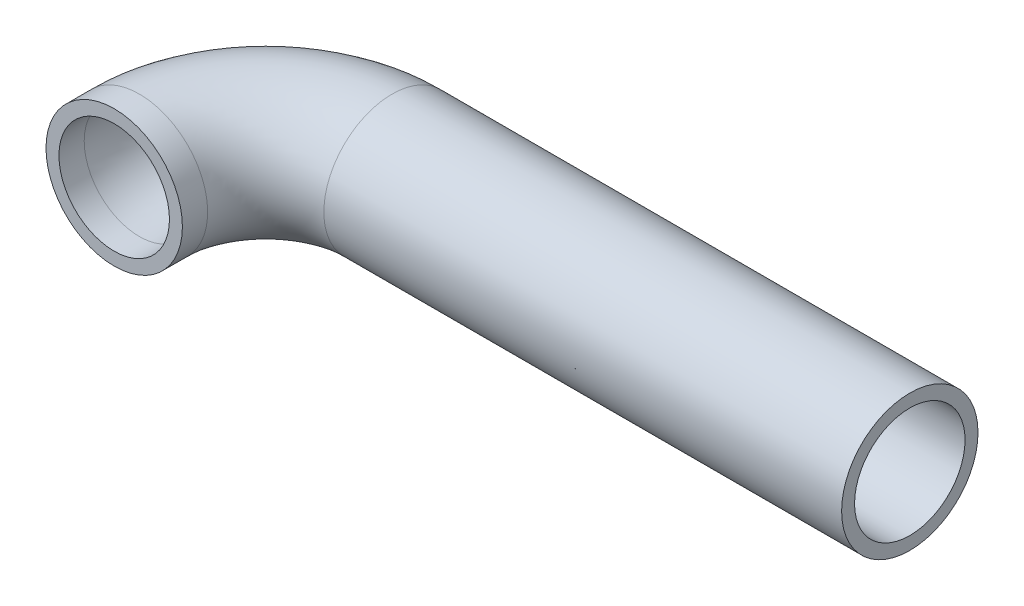
ISO-10303-21;
HEADER;
FILE_DESCRIPTION(('STEP AP214'),'2;1');
FILE_NAME('part.step','',(''),(''),'','','');
FILE_SCHEMA(('AUTOMOTIVE_DESIGN { 1 0 10303 214 1 1 1 1 }'));
ENDSEC;
DATA;
#1=APPLICATION_CONTEXT('core data for automotive mechanical design processes');
#2=APPLICATION_PROTOCOL_DEFINITION('international standard','automotive_design',2000,#1);
#3=PRODUCT_CONTEXT('',#1,'mechanical');
#4=PRODUCT('Part','Part','',(#3));
#5=PRODUCT_RELATED_PRODUCT_CATEGORY('part','',(#4));
#6=PRODUCT_DEFINITION_FORMATION('','',#4);
#7=PRODUCT_DEFINITION_CONTEXT('part definition',#1,'design');
#8=PRODUCT_DEFINITION('design','',#6,#7);
#9=PRODUCT_DEFINITION_SHAPE('','',#8);
#10=(LENGTH_UNIT() NAMED_UNIT(*) SI_UNIT(.MILLI.,.METRE.));
#11=(NAMED_UNIT(*) PLANE_ANGLE_UNIT() SI_UNIT($,.RADIAN.));
#12=(NAMED_UNIT(*) SI_UNIT($,.STERADIAN.) SOLID_ANGLE_UNIT());
#13=UNCERTAINTY_MEASURE_WITH_UNIT(LENGTH_MEASURE(1.E-05),#10,'distance_accuracy_value','');
#14=(GEOMETRIC_REPRESENTATION_CONTEXT(3) GLOBAL_UNCERTAINTY_ASSIGNED_CONTEXT((#13)) GLOBAL_UNIT_ASSIGNED_CONTEXT((#10,
#11,#12)) REPRESENTATION_CONTEXT('',''));
#15=CARTESIAN_POINT('',(0.,0.,0.));
#16=DIRECTION('',(0.,0.,1.));
#17=DIRECTION('',(1.,0.,0.));
#18=AXIS2_PLACEMENT_3D('',#15,#16,#17);
#19=CARTESIAN_POINT('',(0.,0.,0.));
#20=DIRECTION('',(0.,0.,-1.));
#21=DIRECTION('',(-1.,0.,0.));
#22=AXIS2_PLACEMENT_3D('',#19,#20,#21);
#23=CYLINDRICAL_SURFACE('',#22,6.858);
#24=CARTESIAN_POINT('',(0.,0.,-2.54));
#25=DIRECTION('',(0.,0.,1.));
#26=DIRECTION('',(1.,0.,0.));
#27=AXIS2_PLACEMENT_3D('',#24,#25,#26);
#28=CIRCLE('',#27,6.858);
#29=CARTESIAN_POINT('',(-6.858,0.,-2.54));
#30=VERTEX_POINT('',#29);
#31=EDGE_CURVE('E64',#30,#30,#28,.T.);
#32=ORIENTED_EDGE('',*,*,#31,.T.);
#33=EDGE_LOOP('',(#32));
#34=FACE_BOUND('',#33,.T.);
#35=CARTESIAN_POINT('',(0.,0.,0.));
#36=DIRECTION('',(0.,0.,1.));
#37=DIRECTION('',(1.,0.,0.));
#38=AXIS2_PLACEMENT_3D('',#35,#36,#37);
#39=CIRCLE('',#38,6.858);
#40=CARTESIAN_POINT('',(6.858,0.,0.));
#41=VERTEX_POINT('',#40);
#42=EDGE_CURVE('E61',#41,#41,#39,.T.);
#43=ORIENTED_EDGE('',*,*,#42,.F.);
#44=EDGE_LOOP('',(#43));
#45=FACE_BOUND('',#44,.T.);
#46=ADVANCED_FACE('F37',(#34,#45),#23,.T.);
#47=CARTESIAN_POINT('',(12.7,0.,-2.54));
#48=DIRECTION('',(0.,-1.,0.));
#49=DIRECTION('',(0.,0.,-1.));
#50=AXIS2_PLACEMENT_3D('',#47,#48,#49);
#51=TOROIDAL_SURFACE('',#50,12.7,6.858);
#52=CARTESIAN_POINT('',(12.7,0.,-15.24));
#53=DIRECTION('',(-1.,0.,0.));
#54=DIRECTION('',(0.,0.,1.));
#55=AXIS2_PLACEMENT_3D('',#52,#53,#54);
#56=CIRCLE('',#55,6.858);
#57=CARTESIAN_POINT('',(12.7,0.,-22.098));
#58=VERTEX_POINT('',#57);
#59=EDGE_CURVE('E41',#58,#58,#56,.T.);
#60=CARTESIAN_POINT('',(12.7,0.,-2.54));
#61=DIRECTION('',(0.,-1.,0.));
#62=DIRECTION('',(0.,0.,-1.));
#63=AXIS2_PLACEMENT_3D('',#60,#61,#62);
#64=CIRCLE('',#63,19.558);
#65=EDGE_CURVE('',#30,#58,#64,.T.);
#66=ORIENTED_EDGE('',*,*,#31,.F.);
#67=ORIENTED_EDGE('',*,*,#59,.T.);
#68=ORIENTED_EDGE('',*,*,#65,.T.);
#69=ORIENTED_EDGE('',*,*,#65,.F.);
#70=EDGE_LOOP('',(#66,#68,#67,#69));
#71=FACE_BOUND('',#70,.T.);
#72=ADVANCED_FACE('F73',(#71),#51,.T.);
#73=CARTESIAN_POINT('',(12.7,0.,-15.24));
#74=DIRECTION('',(1.,0.,0.));
#75=DIRECTION('',(0.,0.,-1.));
#76=AXIS2_PLACEMENT_3D('',#73,#74,#75);
#77=CYLINDRICAL_SURFACE('',#76,6.858);
#78=CARTESIAN_POINT('',(64.7699999999999,0.,-15.24));
#79=DIRECTION('',(-1.,0.,0.));
#80=DIRECTION('',(0.,0.,1.));
#81=AXIS2_PLACEMENT_3D('',#78,#79,#80);
#82=CIRCLE('',#81,6.858);
#83=CARTESIAN_POINT('',(64.7699999999999,0.,-8.382));
#84=VERTEX_POINT('',#83);
#85=EDGE_CURVE('E56',#84,#84,#82,.T.);
#86=ORIENTED_EDGE('',*,*,#85,.T.);
#87=EDGE_LOOP('',(#86));
#88=FACE_BOUND('',#87,.T.);
#89=ORIENTED_EDGE('',*,*,#59,.F.);
#90=EDGE_LOOP('',(#89));
#91=FACE_BOUND('',#90,.T.);
#92=ADVANCED_FACE('F39',(#88,#91),#77,.T.);
#93=CARTESIAN_POINT('',(0.,0.,0.));
#94=DIRECTION('',(0.,0.,1.));
#95=DIRECTION('',(1.,0.,0.));
#96=AXIS2_PLACEMENT_3D('',#93,#94,#95);
#97=PLANE('',#96);
#98=CARTESIAN_POINT('',(0.,0.,0.));
#99=DIRECTION('',(0.,0.,1.));
#100=DIRECTION('',(1.,0.,0.));
#101=AXIS2_PLACEMENT_3D('',#98,#99,#100);
#102=CIRCLE('',#101,5.55625);
#103=CARTESIAN_POINT('',(5.55625,0.,0.));
#104=VERTEX_POINT('',#103);
#105=EDGE_CURVE('E60',#104,#104,#102,.F.);
#106=ORIENTED_EDGE('',*,*,#105,.T.);
#107=EDGE_LOOP('',(#106));
#108=FACE_BOUND('',#107,.T.);
#109=ORIENTED_EDGE('',*,*,#42,.T.);
#110=EDGE_LOOP('',(#109));
#111=FACE_BOUND('',#110,.T.);
#112=ADVANCED_FACE('F77',(#108,#111),#97,.T.);
#113=CARTESIAN_POINT('',(64.7699999999999,0.,-15.24));
#114=DIRECTION('',(-1.,0.,0.));
#115=DIRECTION('',(0.,0.,1.));
#116=AXIS2_PLACEMENT_3D('',#113,#114,#115);
#117=PLANE('',#116);
#118=CARTESIAN_POINT('',(64.7699999999999,0.,-15.24));
#119=DIRECTION('',(-1.,0.,0.));
#120=DIRECTION('',(0.,0.,1.));
#121=AXIS2_PLACEMENT_3D('',#118,#119,#120);
#122=CIRCLE('',#121,5.55625);
#123=CARTESIAN_POINT('',(64.7699999999999,0.,-9.68375));
#124=VERTEX_POINT('',#123);
#125=EDGE_CURVE('E10',#124,#124,#122,.F.);
#126=ORIENTED_EDGE('',*,*,#125,.F.);
#127=EDGE_LOOP('',(#126));
#128=FACE_BOUND('',#127,.T.);
#129=ORIENTED_EDGE('',*,*,#85,.F.);
#130=EDGE_LOOP('',(#129));
#131=FACE_BOUND('',#130,.T.);
#132=ADVANCED_FACE('F83',(#128,#131),#117,.F.);
#133=CARTESIAN_POINT('',(0.,0.,0.));
#134=DIRECTION('',(0.,0.,-1.));
#135=DIRECTION('',(-1.,0.,0.));
#136=AXIS2_PLACEMENT_3D('',#133,#134,#135);
#137=CYLINDRICAL_SURFACE('',#136,5.55625);
#138=CARTESIAN_POINT('',(0.,0.,-2.54));
#139=DIRECTION('',(0.,0.,1.));
#140=DIRECTION('',(1.,0.,0.));
#141=AXIS2_PLACEMENT_3D('',#138,#139,#140);
#142=CIRCLE('',#141,5.55625);
#143=CARTESIAN_POINT('',(-5.55625,0.,-2.54));
#144=VERTEX_POINT('',#143);
#145=EDGE_CURVE('E52',#144,#144,#142,.F.);
#146=ORIENTED_EDGE('',*,*,#145,.T.);
#147=EDGE_LOOP('',(#146));
#148=FACE_BOUND('',#147,.T.);
#149=ORIENTED_EDGE('',*,*,#105,.F.);
#150=EDGE_LOOP('',(#149));
#151=FACE_BOUND('',#150,.T.);
#152=ADVANCED_FACE('F93',(#148,#151),#137,.F.);
#153=CARTESIAN_POINT('',(12.7,0.,-2.54));
#154=DIRECTION('',(0.,-1.,0.));
#155=DIRECTION('',(0.,0.,-1.));
#156=AXIS2_PLACEMENT_3D('',#153,#154,#155);
#157=TOROIDAL_SURFACE('',#156,12.7,5.55625);
#158=CARTESIAN_POINT('',(12.7,0.,-15.24));
#159=DIRECTION('',(-1.,0.,0.));
#160=DIRECTION('',(0.,0.,1.));
#161=AXIS2_PLACEMENT_3D('',#158,#159,#160);
#162=CIRCLE('',#161,5.55625);
#163=CARTESIAN_POINT('',(12.7,0.,-20.79625));
#164=VERTEX_POINT('',#163);
#165=EDGE_CURVE('E46',#164,#164,#162,.F.);
#166=CARTESIAN_POINT('',(12.7,0.,-2.54));
#167=DIRECTION('',(0.,-1.,0.));
#168=DIRECTION('',(0.,0.,-1.));
#169=AXIS2_PLACEMENT_3D('',#166,#167,#168);
#170=CIRCLE('',#169,18.25625);
#171=EDGE_CURVE('',#144,#164,#170,.T.);
#172=ORIENTED_EDGE('',*,*,#145,.F.);
#173=ORIENTED_EDGE('',*,*,#165,.T.);
#174=ORIENTED_EDGE('',*,*,#171,.T.);
#175=ORIENTED_EDGE('',*,*,#171,.F.);
#176=EDGE_LOOP('',(#172,#174,#173,#175));
#177=FACE_BOUND('',#176,.T.);
#178=ADVANCED_FACE('F88',(#177),#157,.F.);
#179=CARTESIAN_POINT('',(12.7,0.,-15.24));
#180=DIRECTION('',(1.,0.,0.));
#181=DIRECTION('',(0.,0.,-1.));
#182=AXIS2_PLACEMENT_3D('',#179,#180,#181);
#183=CYLINDRICAL_SURFACE('',#182,5.55625);
#184=ORIENTED_EDGE('',*,*,#125,.T.);
#185=EDGE_LOOP('',(#184));
#186=FACE_BOUND('',#185,.T.);
#187=ORIENTED_EDGE('',*,*,#165,.F.);
#188=EDGE_LOOP('',(#187));
#189=FACE_BOUND('',#188,.T.);
#190=ADVANCED_FACE('F86',(#186,#189),#183,.F.);
#191=CLOSED_SHELL('',(#46,#72,#92,#112,#132,#152,#178,#190));
#192=MANIFOLD_SOLID_BREP('B2',#191);
#193=ADVANCED_BREP_SHAPE_REPRESENTATION('',(#18,#192),#14);
#194=SHAPE_DEFINITION_REPRESENTATION(#9,#193);
ENDSEC;
END-ISO-10303-21;
